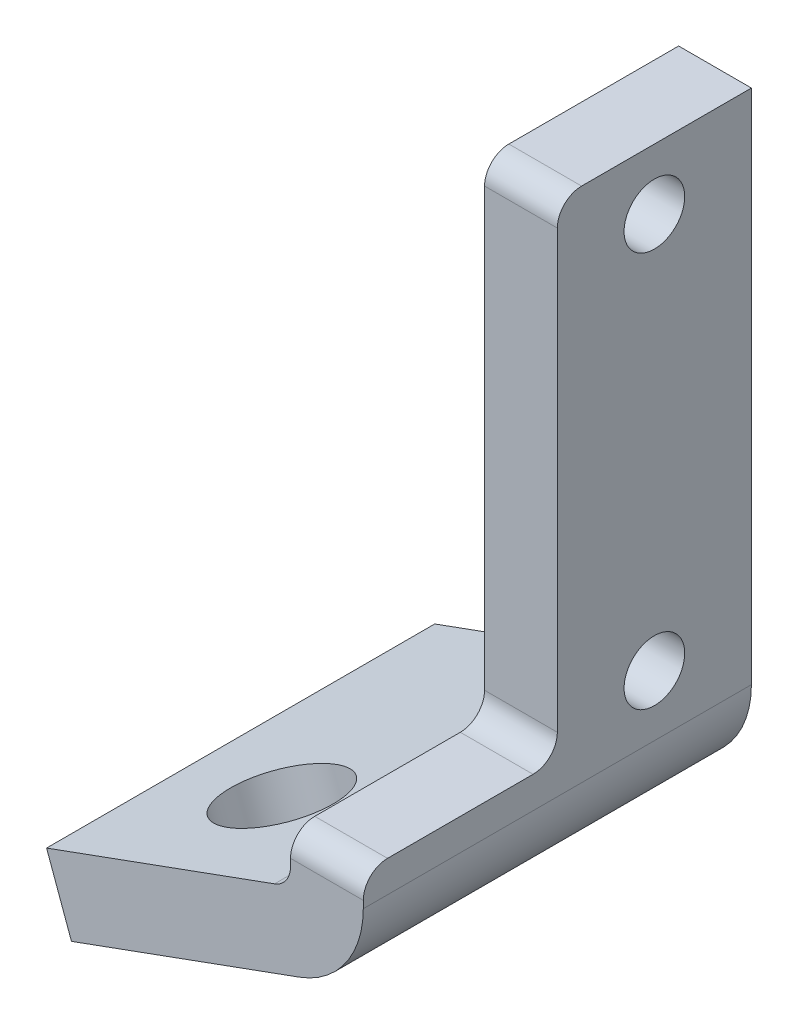
ISO-10303-21;
HEADER;
FILE_DESCRIPTION(('STEP AP214'),'2;1');
FILE_NAME('part.step','',(''),(''),'','','');
FILE_SCHEMA(('AUTOMOTIVE_DESIGN { 1 0 10303 214 1 1 1 1 }'));
ENDSEC;
DATA;
#1=APPLICATION_CONTEXT('core data for automotive mechanical design processes');
#2=APPLICATION_PROTOCOL_DEFINITION('international standard','automotive_design',2000,#1);
#3=PRODUCT_CONTEXT('',#1,'mechanical');
#4=PRODUCT('Part','Part','',(#3));
#5=PRODUCT_RELATED_PRODUCT_CATEGORY('part','',(#4));
#6=PRODUCT_DEFINITION_FORMATION('','',#4);
#7=PRODUCT_DEFINITION_CONTEXT('part definition',#1,'design');
#8=PRODUCT_DEFINITION('design','',#6,#7);
#9=PRODUCT_DEFINITION_SHAPE('','',#8);
#10=(LENGTH_UNIT() NAMED_UNIT(*) SI_UNIT(.MILLI.,.METRE.));
#11=(NAMED_UNIT(*) PLANE_ANGLE_UNIT() SI_UNIT($,.RADIAN.));
#12=(NAMED_UNIT(*) SI_UNIT($,.STERADIAN.) SOLID_ANGLE_UNIT());
#13=UNCERTAINTY_MEASURE_WITH_UNIT(LENGTH_MEASURE(1.E-05),#10,'distance_accuracy_value','');
#14=(GEOMETRIC_REPRESENTATION_CONTEXT(3) GLOBAL_UNCERTAINTY_ASSIGNED_CONTEXT((#13)) GLOBAL_UNIT_ASSIGNED_CONTEXT((#10,
#11,#12)) REPRESENTATION_CONTEXT('',''));
#15=CARTESIAN_POINT('',(0.,0.,0.));
#16=DIRECTION('',(0.,0.,1.));
#17=DIRECTION('',(1.,0.,0.));
#18=AXIS2_PLACEMENT_3D('',#15,#16,#17);
#19=CARTESIAN_POINT('',(-1.5,20.3,16.));
#20=DIRECTION('',(1.,0.,0.));
#21=DIRECTION('',(0.,1.,0.));
#22=AXIS2_PLACEMENT_3D('',#19,#20,#21);
#23=PLANE('',#22);
#24=CARTESIAN_POINT('',(-1.5,1.5,4.));
#25=DIRECTION('',(-1.,0.,0.));
#26=DIRECTION('',(0.,-1.,0.));
#27=AXIS2_PLACEMENT_3D('',#24,#25,#26);
#28=CIRCLE('',#27,1.25);
#29=CARTESIAN_POINT('',(-1.5,0.250000000000001,4.));
#30=VERTEX_POINT('',#29);
#31=EDGE_CURVE('E203',#30,#30,#28,.T.);
#32=ORIENTED_EDGE('',*,*,#31,.F.);
#33=EDGE_LOOP('',(#32));
#34=FACE_BOUND('',#33,.T.);
#35=CARTESIAN_POINT('',(-1.5,17.8,4.));
#36=DIRECTION('',(-1.,0.,0.));
#37=DIRECTION('',(0.,-1.,0.));
#38=AXIS2_PLACEMENT_3D('',#35,#36,#37);
#39=CIRCLE('',#38,1.25);
#40=CARTESIAN_POINT('',(-1.5,16.55,4.));
#41=VERTEX_POINT('',#40);
#42=EDGE_CURVE('E214',#41,#41,#39,.T.);
#43=ORIENTED_EDGE('',*,*,#42,.F.);
#44=EDGE_LOOP('',(#43));
#45=FACE_BOUND('',#44,.T.);
#46=DIRECTION('',(0.,-1.,0.));
#47=VECTOR('',#46,1.);
#48=CARTESIAN_POINT('',(-1.5,20.3,16.));
#49=LINE('',#48,#47);
#50=CARTESIAN_POINT('',(-1.5,-0.699999999999999,16.));
#51=VERTEX_POINT('',#50);
#52=CARTESIAN_POINT('',(-1.5,-1.,16.));
#53=VERTEX_POINT('',#52);
#54=EDGE_CURVE('E130',#51,#53,#49,.T.);
#55=ORIENTED_EDGE('',*,*,#54,.F.);
#56=CARTESIAN_POINT('',(-1.5,-0.699999999999999,15.));
#57=DIRECTION('',(1.,0.,0.));
#58=DIRECTION('',(0.,1.,0.));
#59=AXIS2_PLACEMENT_3D('',#56,#57,#58);
#60=CIRCLE('',#59,1.);
#61=CARTESIAN_POINT('',(-1.5,0.300000000000001,15.));
#62=VERTEX_POINT('',#61);
#63=EDGE_CURVE('E166',#51,#62,#60,.F.);
#64=ORIENTED_EDGE('',*,*,#63,.T.);
#65=DIRECTION('',(0.,0.,1.));
#66=VECTOR('',#65,1.);
#67=CARTESIAN_POINT('',(-1.5,0.300000000000001,8.));
#68=LINE('',#67,#66);
#69=CARTESIAN_POINT('',(-1.5,0.300000000000001,9.00000000000001));
#70=VERTEX_POINT('',#69);
#71=EDGE_CURVE('E185',#70,#62,#68,.T.);
#72=ORIENTED_EDGE('',*,*,#71,.F.);
#73=CARTESIAN_POINT('',(-1.5,1.3,9.00000000000001));
#74=DIRECTION('',(1.,0.,0.));
#75=DIRECTION('',(0.,1.,0.));
#76=AXIS2_PLACEMENT_3D('',#73,#74,#75);
#77=CIRCLE('',#76,1.);
#78=CARTESIAN_POINT('',(-1.5,1.3,8.));
#79=VERTEX_POINT('',#78);
#80=EDGE_CURVE('E41',#70,#79,#77,.T.);
#81=ORIENTED_EDGE('',*,*,#80,.T.);
#82=DIRECTION('',(0.,-1.,0.));
#83=VECTOR('',#82,1.);
#84=CARTESIAN_POINT('',(-1.5,20.3,8.));
#85=LINE('',#84,#83);
#86=CARTESIAN_POINT('',(-1.5,19.3,8.));
#87=VERTEX_POINT('',#86);
#88=EDGE_CURVE('E183',#87,#79,#85,.T.);
#89=ORIENTED_EDGE('',*,*,#88,.F.);
#90=CARTESIAN_POINT('',(-1.5,19.3,7.));
#91=DIRECTION('',(1.,0.,0.));
#92=DIRECTION('',(0.,1.,0.));
#93=AXIS2_PLACEMENT_3D('',#90,#91,#92);
#94=CIRCLE('',#93,1.);
#95=CARTESIAN_POINT('',(-1.5,20.3,7.));
#96=VERTEX_POINT('',#95);
#97=EDGE_CURVE('E155',#87,#96,#94,.F.);
#98=ORIENTED_EDGE('',*,*,#97,.T.);
#99=DIRECTION('',(0.,0.,-1.));
#100=VECTOR('',#99,1.);
#101=CARTESIAN_POINT('',(-1.5,20.3,16.));
#102=LINE('',#101,#100);
#103=CARTESIAN_POINT('',(-1.5,20.3,0.));
#104=VERTEX_POINT('',#103);
#105=EDGE_CURVE('E228',#96,#104,#102,.T.);
#106=ORIENTED_EDGE('',*,*,#105,.T.);
#107=DIRECTION('',(0.,-1.,0.));
#108=VECTOR('',#107,1.);
#109=CARTESIAN_POINT('',(-1.5,20.3,0.));
#110=LINE('',#109,#108);
#111=CARTESIAN_POINT('',(-1.5,-1.,0.));
#112=VERTEX_POINT('',#111);
#113=EDGE_CURVE('E153',#104,#112,#110,.T.);
#114=ORIENTED_EDGE('',*,*,#113,.T.);
#115=DIRECTION('',(0.,0.,-1.));
#116=VECTOR('',#115,1.);
#117=CARTESIAN_POINT('',(-1.5,-1.,16.));
#118=LINE('',#117,#116);
#119=EDGE_CURVE('E145',#53,#112,#118,.T.);
#120=ORIENTED_EDGE('',*,*,#119,.F.);
#121=EDGE_LOOP('',(#55,#64,#72,#81,#89,#98,#106,#114,#120));
#122=FACE_BOUND('',#121,.T.);
#123=ADVANCED_FACE('F33',(#34,#45,#122),#23,.F.);
#124=CARTESIAN_POINT('',(-2.5,-1.,16.));
#125=DIRECTION('',(0.,0.,-1.));
#126=DIRECTION('',(-1.,0.,0.));
#127=AXIS2_PLACEMENT_3D('',#124,#125,#126);
#128=CYLINDRICAL_SURFACE('',#127,0.999999999999999);
#129=CARTESIAN_POINT('',(-2.5,-1.,0.));
#130=DIRECTION('',(0.,0.,-1.));
#131=DIRECTION('',(-1.,0.,0.));
#132=AXIS2_PLACEMENT_3D('',#129,#130,#131);
#133=CIRCLE('',#132,0.999999999999999);
#134=CARTESIAN_POINT('',(-2.15797985667434,-1.93969262078591,0.));
#135=VERTEX_POINT('',#134);
#136=EDGE_CURVE('E230',#112,#135,#133,.T.);
#137=ORIENTED_EDGE('',*,*,#136,.T.);
#138=DIRECTION('',(0.,0.,-1.));
#139=VECTOR('',#138,1.);
#140=CARTESIAN_POINT('',(-2.15797985667434,-1.93969262078591,16.));
#141=LINE('',#140,#139);
#142=CARTESIAN_POINT('',(-2.15797985667434,-1.93969262078591,16.));
#143=VERTEX_POINT('',#142);
#144=EDGE_CURVE('E148',#143,#135,#141,.T.);
#145=ORIENTED_EDGE('',*,*,#144,.F.);
#146=CARTESIAN_POINT('',(-2.5,-1.,16.));
#147=DIRECTION('',(0.,0.,-1.));
#148=DIRECTION('',(-1.,0.,0.));
#149=AXIS2_PLACEMENT_3D('',#146,#147,#148);
#150=CIRCLE('',#149,0.999999999999999);
#151=EDGE_CURVE('E134',#53,#143,#150,.T.);
#152=ORIENTED_EDGE('',*,*,#151,.F.);
#153=ORIENTED_EDGE('',*,*,#119,.T.);
#154=EDGE_LOOP('',(#137,#145,#152,#153));
#155=FACE_BOUND('',#154,.T.);
#156=ADVANCED_FACE('F144',(#155),#128,.F.);
#157=CARTESIAN_POINT('',(-2.15797985667434,-1.93969262078591,16.));
#158=DIRECTION('',(0.342020143325663,-0.93969262078591,0.));
#159=DIRECTION('',(0.939692620785911,0.342020143325663,0.));
#160=AXIS2_PLACEMENT_3D('',#157,#158,#159);
#161=PLANE('',#160);
#162=CARTESIAN_POINT('',(-6.85644296060389,-3.64979333741423,11.));
#163=DIRECTION('',(-0.342020143325663,0.939692620785911,0.));
#164=DIRECTION('',(-0.93969262078591,-0.342020143325663,0.));
#165=AXIS2_PLACEMENT_3D('',#162,#163,#164);
#166=CIRCLE('',#165,2.25);
#167=CARTESIAN_POINT('',(-8.97075135737219,-4.41933865989697,11.));
#168=VERTEX_POINT('',#167);
#169=EDGE_CURVE('E163',#168,#168,#166,.T.);
#170=ORIENTED_EDGE('',*,*,#169,.F.);
#171=EDGE_LOOP('',(#170));
#172=FACE_BOUND('',#171,.T.);
#173=DIRECTION('',(-0.93969262078591,-0.342020143325663,0.));
#174=VECTOR('',#173,1.);
#175=CARTESIAN_POINT('',(-2.15797985667434,-1.93969262078591,0.));
#176=LINE('',#175,#174);
#177=CARTESIAN_POINT('',(-11.5549060645334,-5.35989405404254,0.));
#178=VERTEX_POINT('',#177);
#179=EDGE_CURVE('E232',#135,#178,#176,.T.);
#180=ORIENTED_EDGE('',*,*,#179,.T.);
#181=DIRECTION('',(0.,0.,-1.));
#182=VECTOR('',#181,1.);
#183=CARTESIAN_POINT('',(-11.5549060645334,-5.35989405404254,16.));
#184=LINE('',#183,#182);
#185=CARTESIAN_POINT('',(-11.5549060645334,-5.35989405404254,16.));
#186=VERTEX_POINT('',#185);
#187=EDGE_CURVE('E157',#186,#178,#184,.T.);
#188=ORIENTED_EDGE('',*,*,#187,.F.);
#189=DIRECTION('',(-0.93969262078591,-0.342020143325663,0.));
#190=VECTOR('',#189,1.);
#191=CARTESIAN_POINT('',(-2.15797985667434,-1.93969262078591,16.));
#192=LINE('',#191,#190);
#193=EDGE_CURVE('E150',#143,#186,#192,.T.);
#194=ORIENTED_EDGE('',*,*,#193,.F.);
#195=ORIENTED_EDGE('',*,*,#144,.T.);
#196=EDGE_LOOP('',(#180,#188,#194,#195));
#197=FACE_BOUND('',#196,.T.);
#198=ADVANCED_FACE('F279',(#172,#197),#161,.F.);
#199=CARTESIAN_POINT('',(-11.5549060645334,-5.35989405404254,16.));
#200=DIRECTION('',(0.93969262078591,0.342020143325663,0.));
#201=DIRECTION('',(-0.342020143325663,0.93969262078591,0.));
#202=AXIS2_PLACEMENT_3D('',#199,#200,#201);
#203=PLANE('',#202);
#204=DIRECTION('',(0.342020143325663,-0.93969262078591,0.));
#205=VECTOR('',#204,1.);
#206=CARTESIAN_POINT('',(-11.5549060645334,-5.35989405404254,0.));
#207=LINE('',#206,#205);
#208=CARTESIAN_POINT('',(-10.5288456345564,-8.17897191640028,0.));
#209=VERTEX_POINT('',#208);
#210=EDGE_CURVE('E234',#178,#209,#207,.T.);
#211=ORIENTED_EDGE('',*,*,#210,.T.);
#212=DIRECTION('',(0.,0.,-1.));
#213=VECTOR('',#212,1.);
#214=CARTESIAN_POINT('',(-10.5288456345564,-8.17897191640028,16.));
#215=LINE('',#214,#213);
#216=CARTESIAN_POINT('',(-10.5288456345564,-8.17897191640028,16.));
#217=VERTEX_POINT('',#216);
#218=EDGE_CURVE('E254',#217,#209,#215,.T.);
#219=ORIENTED_EDGE('',*,*,#218,.F.);
#220=DIRECTION('',(0.342020143325663,-0.93969262078591,0.));
#221=VECTOR('',#220,1.);
#222=CARTESIAN_POINT('',(-11.5549060645334,-5.35989405404254,16.));
#223=LINE('',#222,#221);
#224=EDGE_CURVE('E220',#186,#217,#223,.T.);
#225=ORIENTED_EDGE('',*,*,#224,.F.);
#226=ORIENTED_EDGE('',*,*,#187,.T.);
#227=EDGE_LOOP('',(#211,#219,#225,#226));
#228=FACE_BOUND('',#227,.T.);
#229=ADVANCED_FACE('F261',(#228),#203,.F.);
#230=CARTESIAN_POINT('',(-10.5288456345564,-8.17897191640028,16.));
#231=DIRECTION('',(-0.342020143325663,0.93969262078591,0.));
#232=DIRECTION('',(-0.93969262078591,-0.342020143325663,0.));
#233=AXIS2_PLACEMENT_3D('',#230,#231,#232);
#234=PLANE('',#233);
#235=CARTESIAN_POINT('',(-5.8303825306269,-6.46887119977196,11.));
#236=DIRECTION('',(-0.342020143325663,0.93969262078591,0.));
#237=DIRECTION('',(-0.93969262078591,-0.342020143325663,0.));
#238=AXIS2_PLACEMENT_3D('',#235,#236,#237);
#239=CIRCLE('',#238,2.25);
#240=CARTESIAN_POINT('',(-7.9446909273952,-7.2384165222547,11.));
#241=VERTEX_POINT('',#240);
#242=EDGE_CURVE('E161',#241,#241,#239,.T.);
#243=ORIENTED_EDGE('',*,*,#242,.T.);
#244=EDGE_LOOP('',(#243));
#245=FACE_BOUND('',#244,.T.);
#246=DIRECTION('',(0.93969262078591,0.342020143325663,0.));
#247=VECTOR('',#246,1.);
#248=CARTESIAN_POINT('',(-10.5288456345564,-8.17897191640028,0.));
#249=LINE('',#248,#247);
#250=CARTESIAN_POINT('',(-1.13191942669734,-4.75877048314364,0.));
#251=VERTEX_POINT('',#250);
#252=EDGE_CURVE('E236',#209,#251,#249,.T.);
#253=ORIENTED_EDGE('',*,*,#252,.T.);
#254=DIRECTION('',(0.,0.,-1.));
#255=VECTOR('',#254,1.);
#256=CARTESIAN_POINT('',(-1.13191942669734,-4.75877048314364,16.));
#257=LINE('',#256,#255);
#258=CARTESIAN_POINT('',(-1.13191942669734,-4.75877048314364,16.));
#259=VERTEX_POINT('',#258);
#260=EDGE_CURVE('E251',#259,#251,#257,.T.);
#261=ORIENTED_EDGE('',*,*,#260,.F.);
#262=DIRECTION('',(0.93969262078591,0.342020143325663,0.));
#263=VECTOR('',#262,1.);
#264=CARTESIAN_POINT('',(-10.5288456345564,-8.17897191640028,16.));
#265=LINE('',#264,#263);
#266=EDGE_CURVE('E222',#217,#259,#265,.T.);
#267=ORIENTED_EDGE('',*,*,#266,.F.);
#268=ORIENTED_EDGE('',*,*,#218,.T.);
#269=EDGE_LOOP('',(#253,#261,#267,#268));
#270=FACE_BOUND('',#269,.T.);
#271=ADVANCED_FACE('F272',(#245,#270),#234,.F.);
#272=CARTESIAN_POINT('',(-2.5,-1.,16.));
#273=DIRECTION('',(0.,0.,-1.));
#274=DIRECTION('',(-1.,0.,0.));
#275=AXIS2_PLACEMENT_3D('',#272,#273,#274);
#276=CYLINDRICAL_SURFACE('',#275,4.);
#277=CARTESIAN_POINT('',(-2.5,-1.,0.));
#278=DIRECTION('',(0.,0.,1.));
#279=DIRECTION('',(-1.,0.,0.));
#280=AXIS2_PLACEMENT_3D('',#277,#278,#279);
#281=CIRCLE('',#280,4.);
#282=CARTESIAN_POINT('',(1.5,-1.,0.));
#283=VERTEX_POINT('',#282);
#284=EDGE_CURVE('E238',#251,#283,#281,.T.);
#285=ORIENTED_EDGE('',*,*,#284,.T.);
#286=DIRECTION('',(0.,0.,-1.));
#287=VECTOR('',#286,1.);
#288=CARTESIAN_POINT('',(1.5,-1.,16.));
#289=LINE('',#288,#287);
#290=CARTESIAN_POINT('',(1.5,-1.,16.));
#291=VERTEX_POINT('',#290);
#292=EDGE_CURVE('E248',#291,#283,#289,.T.);
#293=ORIENTED_EDGE('',*,*,#292,.F.);
#294=CARTESIAN_POINT('',(-2.5,-1.,16.));
#295=DIRECTION('',(0.,0.,1.));
#296=DIRECTION('',(-1.,0.,0.));
#297=AXIS2_PLACEMENT_3D('',#294,#295,#296);
#298=CIRCLE('',#297,4.);
#299=EDGE_CURVE('E224',#259,#291,#298,.T.);
#300=ORIENTED_EDGE('',*,*,#299,.F.);
#301=ORIENTED_EDGE('',*,*,#260,.T.);
#302=EDGE_LOOP('',(#285,#293,#300,#301));
#303=FACE_BOUND('',#302,.T.);
#304=ADVANCED_FACE('F276',(#303),#276,.T.);
#305=CARTESIAN_POINT('',(1.5,20.3,16.));
#306=DIRECTION('',(-1.,0.,0.));
#307=DIRECTION('',(0.,-1.,0.));
#308=AXIS2_PLACEMENT_3D('',#305,#306,#307);
#309=PLANE('',#308);
#310=CARTESIAN_POINT('',(1.50000000000001,1.5,4.));
#311=DIRECTION('',(-1.,0.,0.));
#312=DIRECTION('',(0.,-1.,0.));
#313=AXIS2_PLACEMENT_3D('',#310,#311,#312);
#314=CIRCLE('',#313,1.25);
#315=CARTESIAN_POINT('',(1.50000000000001,0.250000000000001,4.));
#316=VERTEX_POINT('',#315);
#317=EDGE_CURVE('E206',#316,#316,#314,.T.);
#318=ORIENTED_EDGE('',*,*,#317,.T.);
#319=EDGE_LOOP('',(#318));
#320=FACE_BOUND('',#319,.T.);
#321=CARTESIAN_POINT('',(1.5,17.8,4.));
#322=DIRECTION('',(-1.,0.,0.));
#323=DIRECTION('',(0.,-1.,0.));
#324=AXIS2_PLACEMENT_3D('',#321,#322,#323);
#325=CIRCLE('',#324,1.25);
#326=CARTESIAN_POINT('',(1.5,16.55,4.));
#327=VERTEX_POINT('',#326);
#328=EDGE_CURVE('E211',#327,#327,#325,.T.);
#329=ORIENTED_EDGE('',*,*,#328,.T.);
#330=EDGE_LOOP('',(#329));
#331=FACE_BOUND('',#330,.T.);
#332=DIRECTION('',(0.,0.,1.));
#333=VECTOR('',#332,1.);
#334=CARTESIAN_POINT('',(1.50000000000001,0.300000000000002,8.));
#335=LINE('',#334,#333);
#336=CARTESIAN_POINT('',(1.50000000000001,0.300000000000002,9.00000000000001));
#337=VERTEX_POINT('',#336);
#338=CARTESIAN_POINT('',(1.50000000000001,0.300000000000002,15.));
#339=VERTEX_POINT('',#338);
#340=EDGE_CURVE('E197',#337,#339,#335,.T.);
#341=ORIENTED_EDGE('',*,*,#340,.T.);
#342=CARTESIAN_POINT('',(1.5,-0.699999999999998,15.));
#343=DIRECTION('',(-1.,0.,0.));
#344=DIRECTION('',(0.,-1.,0.));
#345=AXIS2_PLACEMENT_3D('',#342,#343,#344);
#346=CIRCLE('',#345,1.);
#347=CARTESIAN_POINT('',(1.5,-0.699999999999999,16.));
#348=VERTEX_POINT('',#347);
#349=EDGE_CURVE('E175',#339,#348,#346,.F.);
#350=ORIENTED_EDGE('',*,*,#349,.T.);
#351=DIRECTION('',(0.,1.,0.));
#352=VECTOR('',#351,1.);
#353=CARTESIAN_POINT('',(1.5,20.3,16.));
#354=LINE('',#353,#352);
#355=EDGE_CURVE('E226',#291,#348,#354,.T.);
#356=ORIENTED_EDGE('',*,*,#355,.F.);
#357=ORIENTED_EDGE('',*,*,#292,.T.);
#358=DIRECTION('',(0.,1.,0.));
#359=VECTOR('',#358,1.);
#360=CARTESIAN_POINT('',(1.5,20.3,0.));
#361=LINE('',#360,#359);
#362=CARTESIAN_POINT('',(1.5,20.3,0.));
#363=VERTEX_POINT('',#362);
#364=EDGE_CURVE('E240',#283,#363,#361,.T.);
#365=ORIENTED_EDGE('',*,*,#364,.T.);
#366=DIRECTION('',(0.,0.,-1.));
#367=VECTOR('',#366,1.);
#368=CARTESIAN_POINT('',(1.5,20.3,16.));
#369=LINE('',#368,#367);
#370=CARTESIAN_POINT('',(1.5,20.3,7.));
#371=VERTEX_POINT('',#370);
#372=EDGE_CURVE('E246',#371,#363,#369,.T.);
#373=ORIENTED_EDGE('',*,*,#372,.F.);
#374=CARTESIAN_POINT('',(1.5,19.3,7.));
#375=DIRECTION('',(-1.,0.,0.));
#376=DIRECTION('',(0.,-1.,0.));
#377=AXIS2_PLACEMENT_3D('',#374,#375,#376);
#378=CIRCLE('',#377,1.);
#379=CARTESIAN_POINT('',(1.5,19.3,8.));
#380=VERTEX_POINT('',#379);
#381=EDGE_CURVE('E173',#371,#380,#378,.F.);
#382=ORIENTED_EDGE('',*,*,#381,.T.);
#383=DIRECTION('',(0.,-1.,0.));
#384=VECTOR('',#383,1.);
#385=CARTESIAN_POINT('',(1.5,20.3,8.));
#386=LINE('',#385,#384);
#387=CARTESIAN_POINT('',(1.50000000000001,1.3,8.));
#388=VERTEX_POINT('',#387);
#389=EDGE_CURVE('E199',#380,#388,#386,.T.);
#390=ORIENTED_EDGE('',*,*,#389,.T.);
#391=CARTESIAN_POINT('',(1.5,1.3,9.00000000000001));
#392=DIRECTION('',(-1.,0.,0.));
#393=DIRECTION('',(0.,-1.,0.));
#394=AXIS2_PLACEMENT_3D('',#391,#392,#393);
#395=CIRCLE('',#394,1.);
#396=EDGE_CURVE('E11',#388,#337,#395,.T.);
#397=ORIENTED_EDGE('',*,*,#396,.T.);
#398=EDGE_LOOP('',(#341,#350,#356,#357,#365,#373,#382,#390,#397));
#399=FACE_BOUND('',#398,.T.);
#400=ADVANCED_FACE('F196',(#320,#331,#399),#309,.F.);
#401=CARTESIAN_POINT('',(-1.5,20.3,16.));
#402=DIRECTION('',(0.,-1.,0.));
#403=DIRECTION('',(0.,0.,-1.));
#404=AXIS2_PLACEMENT_3D('',#401,#402,#403);
#405=PLANE('',#404);
#406=ORIENTED_EDGE('',*,*,#105,.F.);
#407=DIRECTION('',(-1.,0.,0.));
#408=VECTOR('',#407,1.);
#409=CARTESIAN_POINT('',(-1.5,20.3,7.));
#410=LINE('',#409,#408);
#411=EDGE_CURVE('E48',#96,#371,#410,.F.);
#412=ORIENTED_EDGE('',*,*,#411,.T.);
#413=ORIENTED_EDGE('',*,*,#372,.T.);
#414=DIRECTION('',(-1.,0.,0.));
#415=VECTOR('',#414,1.);
#416=CARTESIAN_POINT('',(-1.5,20.3,0.));
#417=LINE('',#416,#415);
#418=EDGE_CURVE('E140',#363,#104,#417,.T.);
#419=ORIENTED_EDGE('',*,*,#418,.T.);
#420=EDGE_LOOP('',(#406,#412,#413,#419));
#421=FACE_BOUND('',#420,.T.);
#422=ADVANCED_FACE('F311',(#421),#405,.F.);
#423=CARTESIAN_POINT('',(-2.5,-1.,16.));
#424=DIRECTION('',(0.,0.,-1.));
#425=DIRECTION('',(-1.,0.,0.));
#426=AXIS2_PLACEMENT_3D('',#423,#424,#425);
#427=PLANE('',#426);
#428=ORIENTED_EDGE('',*,*,#355,.T.);
#429=DIRECTION('',(-1.,0.,0.));
#430=VECTOR('',#429,1.);
#431=CARTESIAN_POINT('',(-2.5,-0.699999999999999,16.));
#432=LINE('',#431,#430);
#433=EDGE_CURVE('E137',#348,#51,#432,.T.);
#434=ORIENTED_EDGE('',*,*,#433,.T.);
#435=ORIENTED_EDGE('',*,*,#54,.T.);
#436=ORIENTED_EDGE('',*,*,#151,.T.);
#437=ORIENTED_EDGE('',*,*,#193,.T.);
#438=ORIENTED_EDGE('',*,*,#224,.T.);
#439=ORIENTED_EDGE('',*,*,#266,.T.);
#440=ORIENTED_EDGE('',*,*,#299,.T.);
#441=EDGE_LOOP('',(#428,#434,#435,#436,#437,#438,#439,#440));
#442=FACE_BOUND('',#441,.T.);
#443=ADVANCED_FACE('F133',(#442),#427,.F.);
#444=CARTESIAN_POINT('',(-2.5,-1.,0.));
#445=DIRECTION('',(0.,0.,-1.));
#446=DIRECTION('',(-1.,0.,0.));
#447=AXIS2_PLACEMENT_3D('',#444,#445,#446);
#448=PLANE('',#447);
#449=ORIENTED_EDGE('',*,*,#113,.F.);
#450=ORIENTED_EDGE('',*,*,#418,.F.);
#451=ORIENTED_EDGE('',*,*,#364,.F.);
#452=ORIENTED_EDGE('',*,*,#284,.F.);
#453=ORIENTED_EDGE('',*,*,#252,.F.);
#454=ORIENTED_EDGE('',*,*,#210,.F.);
#455=ORIENTED_EDGE('',*,*,#179,.F.);
#456=ORIENTED_EDGE('',*,*,#136,.F.);
#457=EDGE_LOOP('',(#449,#450,#451,#452,#453,#454,#455,#456));
#458=FACE_BOUND('',#457,.T.);
#459=ADVANCED_FACE('F267',(#458),#448,.T.);
#460=CARTESIAN_POINT('',(-4.42327489109269,-10.3348676661344,11.));
#461=DIRECTION('',(-0.342020143325663,0.939692620785911,0.));
#462=DIRECTION('',(-0.939692620785911,-0.342020143325663,0.));
#463=AXIS2_PLACEMENT_3D('',#460,#461,#462);
#464=CYLINDRICAL_SURFACE('',#463,2.25);
#465=ORIENTED_EDGE('',*,*,#169,.T.);
#466=EDGE_LOOP('',(#465));
#467=FACE_BOUND('',#466,.T.);
#468=ORIENTED_EDGE('',*,*,#242,.F.);
#469=EDGE_LOOP('',(#468));
#470=FACE_BOUND('',#469,.T.);
#471=ADVANCED_FACE('F331',(#467,#470),#464,.F.);
#472=CARTESIAN_POINT('',(1.50000000000001,0.300000000000002,8.));
#473=DIRECTION('',(0.,-1.,0.));
#474=DIRECTION('',(1.,0.,0.));
#475=AXIS2_PLACEMENT_3D('',#472,#473,#474);
#476=PLANE('',#475);
#477=ORIENTED_EDGE('',*,*,#71,.T.);
#478=DIRECTION('',(-1.,0.,0.));
#479=VECTOR('',#478,1.);
#480=CARTESIAN_POINT('',(1.50000000000001,0.300000000000002,15.));
#481=LINE('',#480,#479);
#482=EDGE_CURVE('E171',#62,#339,#481,.F.);
#483=ORIENTED_EDGE('',*,*,#482,.T.);
#484=ORIENTED_EDGE('',*,*,#340,.F.);
#485=DIRECTION('',(-1.,0.,0.));
#486=VECTOR('',#485,1.);
#487=CARTESIAN_POINT('',(-1.5,0.300000000000001,9.00000000000001));
#488=LINE('',#487,#486);
#489=EDGE_CURVE('E168',#337,#70,#488,.T.);
#490=ORIENTED_EDGE('',*,*,#489,.T.);
#491=EDGE_LOOP('',(#477,#483,#484,#490));
#492=FACE_BOUND('',#491,.T.);
#493=ADVANCED_FACE('F201',(#492),#476,.F.);
#494=CARTESIAN_POINT('',(1.5,20.3,8.));
#495=DIRECTION('',(0.,0.,-1.));
#496=DIRECTION('',(0.,1.,0.));
#497=AXIS2_PLACEMENT_3D('',#494,#495,#496);
#498=PLANE('',#497);
#499=ORIENTED_EDGE('',*,*,#88,.T.);
#500=DIRECTION('',(-1.,0.,0.));
#501=VECTOR('',#500,1.);
#502=CARTESIAN_POINT('',(1.50000000000001,1.3,8.));
#503=LINE('',#502,#501);
#504=EDGE_CURVE('E56',#79,#388,#503,.F.);
#505=ORIENTED_EDGE('',*,*,#504,.T.);
#506=ORIENTED_EDGE('',*,*,#389,.F.);
#507=DIRECTION('',(-1.,0.,0.));
#508=VECTOR('',#507,1.);
#509=CARTESIAN_POINT('',(1.5,19.3,8.));
#510=LINE('',#509,#508);
#511=EDGE_CURVE('E177',#380,#87,#510,.T.);
#512=ORIENTED_EDGE('',*,*,#511,.T.);
#513=EDGE_LOOP('',(#499,#505,#506,#512));
#514=FACE_BOUND('',#513,.T.);
#515=ADVANCED_FACE('F188',(#514),#498,.F.);
#516=CARTESIAN_POINT('',(1.5,17.8,4.));
#517=DIRECTION('',(-1.,0.,0.));
#518=DIRECTION('',(0.,-1.,0.));
#519=AXIS2_PLACEMENT_3D('',#516,#517,#518);
#520=CYLINDRICAL_SURFACE('',#519,1.25);
#521=ORIENTED_EDGE('',*,*,#328,.F.);
#522=EDGE_LOOP('',(#521));
#523=FACE_BOUND('',#522,.T.);
#524=ORIENTED_EDGE('',*,*,#42,.T.);
#525=EDGE_LOOP('',(#524));
#526=FACE_BOUND('',#525,.T.);
#527=ADVANCED_FACE('F341',(#523,#526),#520,.F.);
#528=CARTESIAN_POINT('',(1.50000000000001,1.5,4.));
#529=DIRECTION('',(-1.,0.,0.));
#530=DIRECTION('',(0.,-1.,0.));
#531=AXIS2_PLACEMENT_3D('',#528,#529,#530);
#532=CYLINDRICAL_SURFACE('',#531,1.25);
#533=ORIENTED_EDGE('',*,*,#317,.F.);
#534=EDGE_LOOP('',(#533));
#535=FACE_BOUND('',#534,.T.);
#536=ORIENTED_EDGE('',*,*,#31,.T.);
#537=EDGE_LOOP('',(#536));
#538=FACE_BOUND('',#537,.T.);
#539=ADVANCED_FACE('F300',(#535,#538),#532,.F.);
#540=CARTESIAN_POINT('',(-2.5,-0.699999999999999,15.));
#541=DIRECTION('',(-1.,0.,0.));
#542=DIRECTION('',(0.,-1.,0.));
#543=AXIS2_PLACEMENT_3D('',#540,#541,#542);
#544=CYLINDRICAL_SURFACE('',#543,1.);
#545=ORIENTED_EDGE('',*,*,#349,.F.);
#546=ORIENTED_EDGE('',*,*,#482,.F.);
#547=ORIENTED_EDGE('',*,*,#63,.F.);
#548=ORIENTED_EDGE('',*,*,#433,.F.);
#549=EDGE_LOOP('',(#545,#546,#547,#548));
#550=FACE_BOUND('',#549,.T.);
#551=ADVANCED_FACE('F298',(#550),#544,.T.);
#552=CARTESIAN_POINT('',(1.50000000000001,1.3,9.00000000000001));
#553=DIRECTION('',(1.,0.,0.));
#554=DIRECTION('',(0.,1.,0.));
#555=AXIS2_PLACEMENT_3D('',#552,#553,#554);
#556=CYLINDRICAL_SURFACE('',#555,1.);
#557=ORIENTED_EDGE('',*,*,#396,.F.);
#558=ORIENTED_EDGE('',*,*,#504,.F.);
#559=ORIENTED_EDGE('',*,*,#80,.F.);
#560=ORIENTED_EDGE('',*,*,#489,.F.);
#561=EDGE_LOOP('',(#557,#558,#559,#560));
#562=FACE_BOUND('',#561,.T.);
#563=ADVANCED_FACE('F192',(#562),#556,.F.);
#564=CARTESIAN_POINT('',(1.5,19.3,7.));
#565=DIRECTION('',(-1.,0.,0.));
#566=DIRECTION('',(0.,0.,1.));
#567=AXIS2_PLACEMENT_3D('',#564,#565,#566);
#568=CYLINDRICAL_SURFACE('',#567,1.);
#569=ORIENTED_EDGE('',*,*,#381,.F.);
#570=ORIENTED_EDGE('',*,*,#411,.F.);
#571=ORIENTED_EDGE('',*,*,#97,.F.);
#572=ORIENTED_EDGE('',*,*,#511,.F.);
#573=EDGE_LOOP('',(#569,#570,#571,#572));
#574=FACE_BOUND('',#573,.T.);
#575=ADVANCED_FACE('F35',(#574),#568,.T.);
#576=CLOSED_SHELL('',(#123,#156,#198,#229,#271,#304,#400,#422,#443,#459,#471,#493,#515,#527,
#539,#551,#563,#575));
#577=MANIFOLD_SOLID_BREP('B2',#576);
#578=ADVANCED_BREP_SHAPE_REPRESENTATION('',(#18,#577),#14);
#579=SHAPE_DEFINITION_REPRESENTATION(#9,#578);
ENDSEC;
END-ISO-10303-21;
